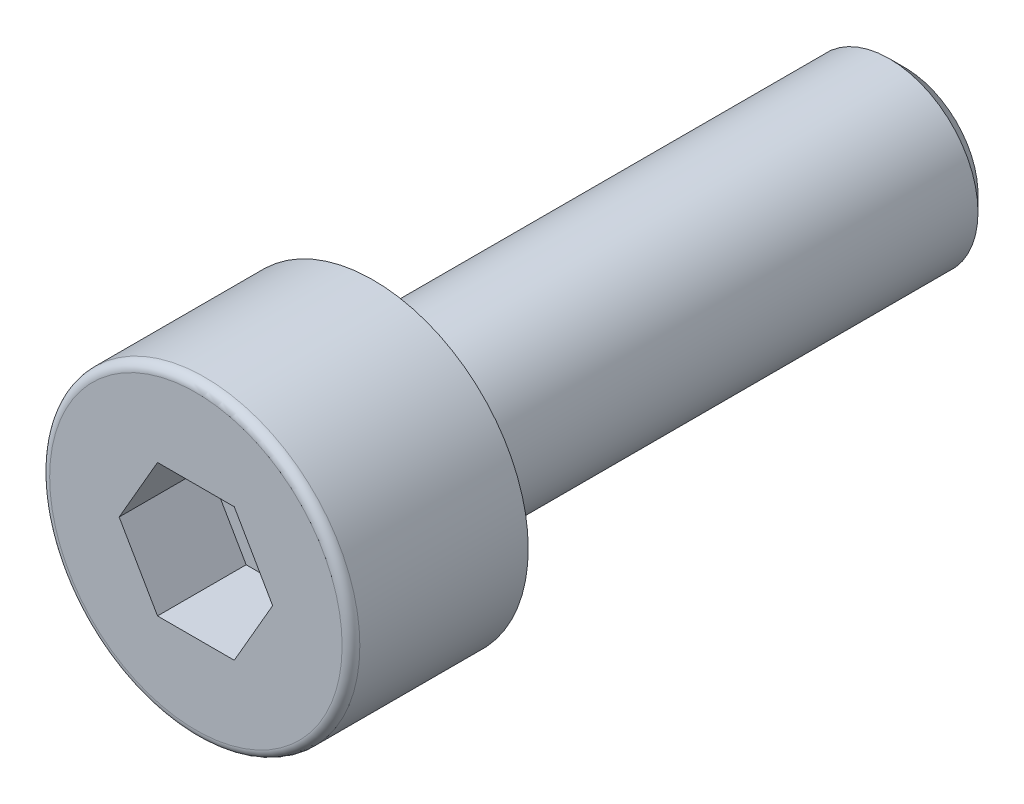
ISO-10303-21;
HEADER;
FILE_DESCRIPTION(('STEP AP214'),'2;1');
FILE_NAME('part.step','',(''),(''),'','','');
FILE_SCHEMA(('AUTOMOTIVE_DESIGN { 1 0 10303 214 1 1 1 1 }'));
ENDSEC;
DATA;
#1=APPLICATION_CONTEXT('core data for automotive mechanical design processes');
#2=APPLICATION_PROTOCOL_DEFINITION('international standard','automotive_design',2000,#1);
#3=PRODUCT_CONTEXT('',#1,'mechanical');
#4=PRODUCT('Part','Part','',(#3));
#5=PRODUCT_RELATED_PRODUCT_CATEGORY('part','',(#4));
#6=PRODUCT_DEFINITION_FORMATION('','',#4);
#7=PRODUCT_DEFINITION_CONTEXT('part definition',#1,'design');
#8=PRODUCT_DEFINITION('design','',#6,#7);
#9=PRODUCT_DEFINITION_SHAPE('','',#8);
#10=(LENGTH_UNIT() NAMED_UNIT(*) SI_UNIT(.MILLI.,.METRE.));
#11=(NAMED_UNIT(*) PLANE_ANGLE_UNIT() SI_UNIT($,.RADIAN.));
#12=(NAMED_UNIT(*) SI_UNIT($,.STERADIAN.) SOLID_ANGLE_UNIT());
#13=UNCERTAINTY_MEASURE_WITH_UNIT(LENGTH_MEASURE(1.E-05),#10,'distance_accuracy_value','');
#14=(GEOMETRIC_REPRESENTATION_CONTEXT(3) GLOBAL_UNCERTAINTY_ASSIGNED_CONTEXT((#13)) GLOBAL_UNIT_ASSIGNED_CONTEXT((#10,
#11,#12)) REPRESENTATION_CONTEXT('',''));
#15=CARTESIAN_POINT('',(0.,0.,0.));
#16=DIRECTION('',(0.,0.,1.));
#17=DIRECTION('',(1.,0.,0.));
#18=AXIS2_PLACEMENT_3D('',#15,#16,#17);
#19=CARTESIAN_POINT('',(0.,0.,-12.));
#20=DIRECTION('',(0.,0.,-1.));
#21=DIRECTION('',(-1.,0.,0.));
#22=AXIS2_PLACEMENT_3D('',#19,#20,#21);
#23=PLANE('',#22);
#24=CARTESIAN_POINT('',(0.,0.,-12.));
#25=DIRECTION('',(0.,0.,-1.));
#26=DIRECTION('',(-1.,0.,0.));
#27=AXIS2_PLACEMENT_3D('',#24,#25,#26);
#28=CIRCLE('',#27,1.64999999999999);
#29=CARTESIAN_POINT('',(-1.64999999999999,0.,-12.));
#30=VERTEX_POINT('',#29);
#31=EDGE_CURVE('E11',#30,#30,#28,.T.);
#32=ORIENTED_EDGE('',*,*,#31,.T.);
#33=EDGE_LOOP('',(#32));
#34=FACE_BOUND('',#33,.T.);
#35=ADVANCED_FACE('F53',(#34),#23,.T.);
#36=CARTESIAN_POINT('',(0.,0.,4.));
#37=DIRECTION('',(0.,0.,1.));
#38=DIRECTION('',(1.,0.,0.));
#39=AXIS2_PLACEMENT_3D('',#36,#37,#38);
#40=CYLINDRICAL_SURFACE('',#39,2.);
#41=CARTESIAN_POINT('',(0.,0.,-11.65));
#42=DIRECTION('',(0.,0.,-1.));
#43=DIRECTION('',(-1.,0.,0.));
#44=AXIS2_PLACEMENT_3D('',#41,#42,#43);
#45=CIRCLE('',#44,2.);
#46=CARTESIAN_POINT('',(-1.99999999999999,0.,-11.65));
#47=VERTEX_POINT('',#46);
#48=EDGE_CURVE('E62',#47,#47,#45,.F.);
#49=ORIENTED_EDGE('',*,*,#48,.T.);
#50=EDGE_LOOP('',(#49));
#51=FACE_BOUND('',#50,.T.);
#52=CARTESIAN_POINT('',(0.,0.,0.));
#53=DIRECTION('',(0.,0.,1.));
#54=DIRECTION('',(1.,0.,0.));
#55=AXIS2_PLACEMENT_3D('',#52,#53,#54);
#56=CIRCLE('',#55,2.);
#57=CARTESIAN_POINT('',(2.,0.,0.));
#58=VERTEX_POINT('',#57);
#59=EDGE_CURVE('E190',#58,#58,#56,.T.);
#60=ORIENTED_EDGE('',*,*,#59,.F.);
#61=EDGE_LOOP('',(#60));
#62=FACE_BOUND('',#61,.T.);
#63=ADVANCED_FACE('F198',(#51,#62),#40,.T.);
#64=CARTESIAN_POINT('',(2.,0.,0.));
#65=DIRECTION('',(0.,0.,-1.));
#66=DIRECTION('',(-1.,0.,0.));
#67=AXIS2_PLACEMENT_3D('',#64,#65,#66);
#68=PLANE('',#67);
#69=ORIENTED_EDGE('',*,*,#59,.T.);
#70=EDGE_LOOP('',(#69));
#71=FACE_BOUND('',#70,.T.);
#72=CARTESIAN_POINT('',(0.,0.,0.));
#73=DIRECTION('',(0.,0.,1.));
#74=DIRECTION('',(1.,0.,0.));
#75=AXIS2_PLACEMENT_3D('',#72,#73,#74);
#76=CIRCLE('',#75,3.5);
#77=CARTESIAN_POINT('',(3.5,0.,0.));
#78=VERTEX_POINT('',#77);
#79=EDGE_CURVE('E186',#78,#78,#76,.T.);
#80=ORIENTED_EDGE('',*,*,#79,.F.);
#81=EDGE_LOOP('',(#80));
#82=FACE_BOUND('',#81,.T.);
#83=ADVANCED_FACE('F215',(#71,#82),#68,.T.);
#84=CARTESIAN_POINT('',(0.,0.,4.));
#85=DIRECTION('',(0.,0.,1.));
#86=DIRECTION('',(1.,0.,0.));
#87=AXIS2_PLACEMENT_3D('',#84,#85,#86);
#88=CYLINDRICAL_SURFACE('',#87,3.5);
#89=ORIENTED_EDGE('',*,*,#79,.T.);
#90=EDGE_LOOP('',(#89));
#91=FACE_BOUND('',#90,.T.);
#92=CARTESIAN_POINT('',(0.,0.,3.8));
#93=DIRECTION('',(0.,0.,1.));
#94=DIRECTION('',(1.,0.,0.));
#95=AXIS2_PLACEMENT_3D('',#92,#93,#94);
#96=CIRCLE('',#95,3.5);
#97=CARTESIAN_POINT('',(3.5,0.,3.8));
#98=VERTEX_POINT('',#97);
#99=EDGE_CURVE('E182',#98,#98,#96,.T.);
#100=ORIENTED_EDGE('',*,*,#99,.F.);
#101=EDGE_LOOP('',(#100));
#102=FACE_BOUND('',#101,.T.);
#103=ADVANCED_FACE('F220',(#91,#102),#88,.T.);
#104=CARTESIAN_POINT('',(0.,0.,3.8));
#105=DIRECTION('',(0.,0.,1.));
#106=DIRECTION('',(1.,0.,0.));
#107=AXIS2_PLACEMENT_3D('',#104,#105,#106);
#108=TOROIDAL_SURFACE('',#107,3.3,0.2);
#109=ORIENTED_EDGE('',*,*,#99,.T.);
#110=EDGE_LOOP('',(#109));
#111=FACE_BOUND('',#110,.T.);
#112=CARTESIAN_POINT('',(0.,0.,4.));
#113=DIRECTION('',(0.,0.,1.));
#114=DIRECTION('',(1.,0.,0.));
#115=AXIS2_PLACEMENT_3D('',#112,#113,#114);
#116=CIRCLE('',#115,3.3);
#117=CARTESIAN_POINT('',(3.3,0.,4.));
#118=VERTEX_POINT('',#117);
#119=EDGE_CURVE('E169',#118,#118,#116,.T.);
#120=ORIENTED_EDGE('',*,*,#119,.F.);
#121=EDGE_LOOP('',(#120));
#122=FACE_BOUND('',#121,.T.);
#123=ADVANCED_FACE('F224',(#111,#122),#108,.T.);
#124=CARTESIAN_POINT('',(3.3,0.,4.));
#125=DIRECTION('',(0.,0.,1.));
#126=DIRECTION('',(1.,0.,0.));
#127=AXIS2_PLACEMENT_3D('',#124,#125,#126);
#128=PLANE('',#127);
#129=DIRECTION('',(0.5,0.866025403784439,0.));
#130=VECTOR('',#129,1.);
#131=CARTESIAN_POINT('',(0.866025403784438,-1.5,4.));
#132=LINE('',#131,#130);
#133=CARTESIAN_POINT('',(0.866025403784438,-1.5,4.));
#134=VERTEX_POINT('',#133);
#135=CARTESIAN_POINT('',(1.73205080756888,0.,4.));
#136=VERTEX_POINT('',#135);
#137=EDGE_CURVE('E69',#134,#136,#132,.T.);
#138=ORIENTED_EDGE('',*,*,#137,.F.);
#139=DIRECTION('',(1.,0.,0.));
#140=VECTOR('',#139,1.);
#141=CARTESIAN_POINT('',(-0.866025403784437,-1.5,4.));
#142=LINE('',#141,#140);
#143=CARTESIAN_POINT('',(-0.866025403784437,-1.5,4.));
#144=VERTEX_POINT('',#143);
#145=EDGE_CURVE('E163',#144,#134,#142,.T.);
#146=ORIENTED_EDGE('',*,*,#145,.F.);
#147=DIRECTION('',(0.5,-0.866025403784438,0.));
#148=VECTOR('',#147,1.);
#149=CARTESIAN_POINT('',(-1.73205080756888,0.,4.));
#150=LINE('',#149,#148);
#151=CARTESIAN_POINT('',(-1.73205080756888,0.,4.));
#152=VERTEX_POINT('',#151);
#153=EDGE_CURVE('E160',#152,#144,#150,.T.);
#154=ORIENTED_EDGE('',*,*,#153,.F.);
#155=DIRECTION('',(-0.5,-0.866025403784439,0.));
#156=VECTOR('',#155,1.);
#157=CARTESIAN_POINT('',(-0.866025403784438,1.5,4.));
#158=LINE('',#157,#156);
#159=CARTESIAN_POINT('',(-0.866025403784438,1.5,4.));
#160=VERTEX_POINT('',#159);
#161=EDGE_CURVE('E117',#160,#152,#158,.T.);
#162=ORIENTED_EDGE('',*,*,#161,.F.);
#163=DIRECTION('',(-1.,0.,0.));
#164=VECTOR('',#163,1.);
#165=CARTESIAN_POINT('',(0.866025403784438,1.5,4.));
#166=LINE('',#165,#164);
#167=CARTESIAN_POINT('',(0.866025403784438,1.5,4.));
#168=VERTEX_POINT('',#167);
#169=EDGE_CURVE('E154',#168,#160,#166,.T.);
#170=ORIENTED_EDGE('',*,*,#169,.F.);
#171=DIRECTION('',(-0.5,0.866025403784438,0.));
#172=VECTOR('',#171,1.);
#173=CARTESIAN_POINT('',(1.73205080756888,0.,4.));
#174=LINE('',#173,#172);
#175=EDGE_CURVE('E150',#136,#168,#174,.T.);
#176=ORIENTED_EDGE('',*,*,#175,.F.);
#177=EDGE_LOOP('',(#138,#146,#154,#162,#170,#176));
#178=FACE_BOUND('',#177,.T.);
#179=ORIENTED_EDGE('',*,*,#119,.T.);
#180=EDGE_LOOP('',(#179));
#181=FACE_BOUND('',#180,.T.);
#182=ADVANCED_FACE('F228',(#178,#181),#128,.T.);
#183=CARTESIAN_POINT('',(0.866025403784438,-1.5,2.));
#184=DIRECTION('',(0.866025403784439,-0.499999999999999,0.));
#185=DIRECTION('',(0.5,0.866025403784439,0.));
#186=AXIS2_PLACEMENT_3D('',#183,#184,#185);
#187=PLANE('',#186);
#188=ORIENTED_EDGE('',*,*,#137,.T.);
#189=DIRECTION('',(0.,0.,1.));
#190=VECTOR('',#189,1.);
#191=CARTESIAN_POINT('',(1.73205080756888,0.,2.));
#192=LINE('',#191,#190);
#193=CARTESIAN_POINT('',(1.73205080756888,0.,2.));
#194=VERTEX_POINT('',#193);
#195=EDGE_CURVE('E99',#194,#136,#192,.T.);
#196=ORIENTED_EDGE('',*,*,#195,.F.);
#197=DIRECTION('',(0.5,0.866025403784439,0.));
#198=VECTOR('',#197,1.);
#199=CARTESIAN_POINT('',(0.866025403784438,-1.5,2.));
#200=LINE('',#199,#198);
#201=CARTESIAN_POINT('',(0.866025403784438,-1.5,2.));
#202=VERTEX_POINT('',#201);
#203=EDGE_CURVE('E166',#202,#194,#200,.T.);
#204=ORIENTED_EDGE('',*,*,#203,.F.);
#205=DIRECTION('',(0.,0.,1.));
#206=VECTOR('',#205,1.);
#207=CARTESIAN_POINT('',(0.866025403784438,-1.5,2.));
#208=LINE('',#207,#206);
#209=EDGE_CURVE('E77',#202,#134,#208,.T.);
#210=ORIENTED_EDGE('',*,*,#209,.T.);
#211=EDGE_LOOP('',(#188,#196,#204,#210));
#212=FACE_BOUND('',#211,.T.);
#213=ADVANCED_FACE('F232',(#212),#187,.F.);
#214=CARTESIAN_POINT('',(-0.866025403784437,-1.5,2.));
#215=DIRECTION('',(0.,-1.,0.));
#216=DIRECTION('',(1.,0.,0.));
#217=AXIS2_PLACEMENT_3D('',#214,#215,#216);
#218=PLANE('',#217);
#219=ORIENTED_EDGE('',*,*,#145,.T.);
#220=ORIENTED_EDGE('',*,*,#209,.F.);
#221=DIRECTION('',(1.,0.,0.));
#222=VECTOR('',#221,1.);
#223=CARTESIAN_POINT('',(-0.866025403784437,-1.5,2.));
#224=LINE('',#223,#222);
#225=CARTESIAN_POINT('',(-0.866025403784437,-1.5,2.));
#226=VERTEX_POINT('',#225);
#227=EDGE_CURVE('E131',#226,#202,#224,.T.);
#228=ORIENTED_EDGE('',*,*,#227,.F.);
#229=DIRECTION('',(0.,0.,1.));
#230=VECTOR('',#229,1.);
#231=CARTESIAN_POINT('',(-0.866025403784437,-1.5,2.));
#232=LINE('',#231,#230);
#233=EDGE_CURVE('E122',#226,#144,#232,.T.);
#234=ORIENTED_EDGE('',*,*,#233,.T.);
#235=EDGE_LOOP('',(#219,#220,#228,#234));
#236=FACE_BOUND('',#235,.T.);
#237=ADVANCED_FACE('F236',(#236),#218,.F.);
#238=CARTESIAN_POINT('',(-1.73205080756888,0.,2.));
#239=DIRECTION('',(-0.866025403784439,-0.5,0.));
#240=DIRECTION('',(0.5,-0.866025403784438,0.));
#241=AXIS2_PLACEMENT_3D('',#238,#239,#240);
#242=PLANE('',#241);
#243=ORIENTED_EDGE('',*,*,#153,.T.);
#244=ORIENTED_EDGE('',*,*,#233,.F.);
#245=DIRECTION('',(0.5,-0.866025403784438,0.));
#246=VECTOR('',#245,1.);
#247=CARTESIAN_POINT('',(-1.73205080756888,0.,2.));
#248=LINE('',#247,#246);
#249=CARTESIAN_POINT('',(-1.73205080756888,0.,2.));
#250=VERTEX_POINT('',#249);
#251=EDGE_CURVE('E126',#250,#226,#248,.T.);
#252=ORIENTED_EDGE('',*,*,#251,.F.);
#253=DIRECTION('',(0.,0.,1.));
#254=VECTOR('',#253,1.);
#255=CARTESIAN_POINT('',(-1.73205080756888,0.,2.));
#256=LINE('',#255,#254);
#257=EDGE_CURVE('E110',#250,#152,#256,.T.);
#258=ORIENTED_EDGE('',*,*,#257,.T.);
#259=EDGE_LOOP('',(#243,#244,#252,#258));
#260=FACE_BOUND('',#259,.T.);
#261=ADVANCED_FACE('F127',(#260),#242,.F.);
#262=CARTESIAN_POINT('',(-0.866025403784438,1.5,2.));
#263=DIRECTION('',(-0.866025403784439,0.499999999999999,0.));
#264=DIRECTION('',(-0.5,-0.866025403784439,0.));
#265=AXIS2_PLACEMENT_3D('',#262,#263,#264);
#266=PLANE('',#265);
#267=ORIENTED_EDGE('',*,*,#161,.T.);
#268=ORIENTED_EDGE('',*,*,#257,.F.);
#269=DIRECTION('',(-0.5,-0.866025403784439,0.));
#270=VECTOR('',#269,1.);
#271=CARTESIAN_POINT('',(-0.866025403784438,1.5,2.));
#272=LINE('',#271,#270);
#273=CARTESIAN_POINT('',(-0.866025403784438,1.5,2.));
#274=VERTEX_POINT('',#273);
#275=EDGE_CURVE('E114',#274,#250,#272,.T.);
#276=ORIENTED_EDGE('',*,*,#275,.F.);
#277=DIRECTION('',(0.,0.,1.));
#278=VECTOR('',#277,1.);
#279=CARTESIAN_POINT('',(-0.866025403784438,1.5,2.));
#280=LINE('',#279,#278);
#281=EDGE_CURVE('E123',#274,#160,#280,.T.);
#282=ORIENTED_EDGE('',*,*,#281,.T.);
#283=EDGE_LOOP('',(#267,#268,#276,#282));
#284=FACE_BOUND('',#283,.T.);
#285=ADVANCED_FACE('F112',(#284),#266,.F.);
#286=CARTESIAN_POINT('',(0.866025403784438,1.5,2.));
#287=DIRECTION('',(0.,1.,0.));
#288=DIRECTION('',(-1.,0.,0.));
#289=AXIS2_PLACEMENT_3D('',#286,#287,#288);
#290=PLANE('',#289);
#291=ORIENTED_EDGE('',*,*,#169,.T.);
#292=ORIENTED_EDGE('',*,*,#281,.F.);
#293=DIRECTION('',(-1.,0.,0.));
#294=VECTOR('',#293,1.);
#295=CARTESIAN_POINT('',(0.866025403784438,1.5,2.));
#296=LINE('',#295,#294);
#297=CARTESIAN_POINT('',(0.866025403784438,1.5,2.));
#298=VERTEX_POINT('',#297);
#299=EDGE_CURVE('E137',#298,#274,#296,.T.);
#300=ORIENTED_EDGE('',*,*,#299,.F.);
#301=DIRECTION('',(0.,0.,1.));
#302=VECTOR('',#301,1.);
#303=CARTESIAN_POINT('',(0.866025403784438,1.5,2.));
#304=LINE('',#303,#302);
#305=EDGE_CURVE('E174',#298,#168,#304,.T.);
#306=ORIENTED_EDGE('',*,*,#305,.T.);
#307=EDGE_LOOP('',(#291,#292,#300,#306));
#308=FACE_BOUND('',#307,.T.);
#309=ADVANCED_FACE('F239',(#308),#290,.F.);
#310=CARTESIAN_POINT('',(1.73205080756888,0.,2.));
#311=DIRECTION('',(0.866025403784438,0.5,0.));
#312=DIRECTION('',(-0.5,0.866025403784438,0.));
#313=AXIS2_PLACEMENT_3D('',#310,#311,#312);
#314=PLANE('',#313);
#315=ORIENTED_EDGE('',*,*,#175,.T.);
#316=ORIENTED_EDGE('',*,*,#305,.F.);
#317=DIRECTION('',(-0.5,0.866025403784438,0.));
#318=VECTOR('',#317,1.);
#319=CARTESIAN_POINT('',(1.73205080756888,0.,2.));
#320=LINE('',#319,#318);
#321=EDGE_CURVE('E142',#194,#298,#320,.T.);
#322=ORIENTED_EDGE('',*,*,#321,.F.);
#323=ORIENTED_EDGE('',*,*,#195,.T.);
#324=EDGE_LOOP('',(#315,#316,#322,#323));
#325=FACE_BOUND('',#324,.T.);
#326=ADVANCED_FACE('F206',(#325),#314,.F.);
#327=CARTESIAN_POINT('',(1.73205080756888,0.,2.));
#328=DIRECTION('',(0.,0.,1.));
#329=DIRECTION('',(1.,0.,0.));
#330=AXIS2_PLACEMENT_3D('',#327,#328,#329);
#331=PLANE('',#330);
#332=ORIENTED_EDGE('',*,*,#203,.T.);
#333=ORIENTED_EDGE('',*,*,#321,.T.);
#334=ORIENTED_EDGE('',*,*,#299,.T.);
#335=ORIENTED_EDGE('',*,*,#275,.T.);
#336=ORIENTED_EDGE('',*,*,#251,.T.);
#337=ORIENTED_EDGE('',*,*,#227,.T.);
#338=EDGE_LOOP('',(#332,#333,#334,#335,#336,#337));
#339=FACE_BOUND('',#338,.T.);
#340=ADVANCED_FACE('F134',(#339),#331,.T.);
#341=CARTESIAN_POINT('',(0.,0.,-11.65));
#342=DIRECTION('',(0.,0.,1.));
#343=DIRECTION('',(1.,0.,0.));
#344=AXIS2_PLACEMENT_3D('',#341,#342,#343);
#345=CONICAL_SURFACE('',#344,2.,0.785398163397451);
#346=ORIENTED_EDGE('',*,*,#31,.F.);
#347=EDGE_LOOP('',(#346));
#348=FACE_BOUND('',#347,.T.);
#349=ORIENTED_EDGE('',*,*,#48,.F.);
#350=EDGE_LOOP('',(#349));
#351=FACE_BOUND('',#350,.T.);
#352=ADVANCED_FACE('F55',(#348,#351),#345,.T.);
#353=CLOSED_SHELL('',(#35,#63,#83,#103,#123,#182,#213,#237,#261,#285,#309,#326,#340,#352));
#354=MANIFOLD_SOLID_BREP('B2',#353);
#355=ADVANCED_BREP_SHAPE_REPRESENTATION('',(#18,#354),#14);
#356=SHAPE_DEFINITION_REPRESENTATION(#9,#355);
ENDSEC;
END-ISO-10303-21;
